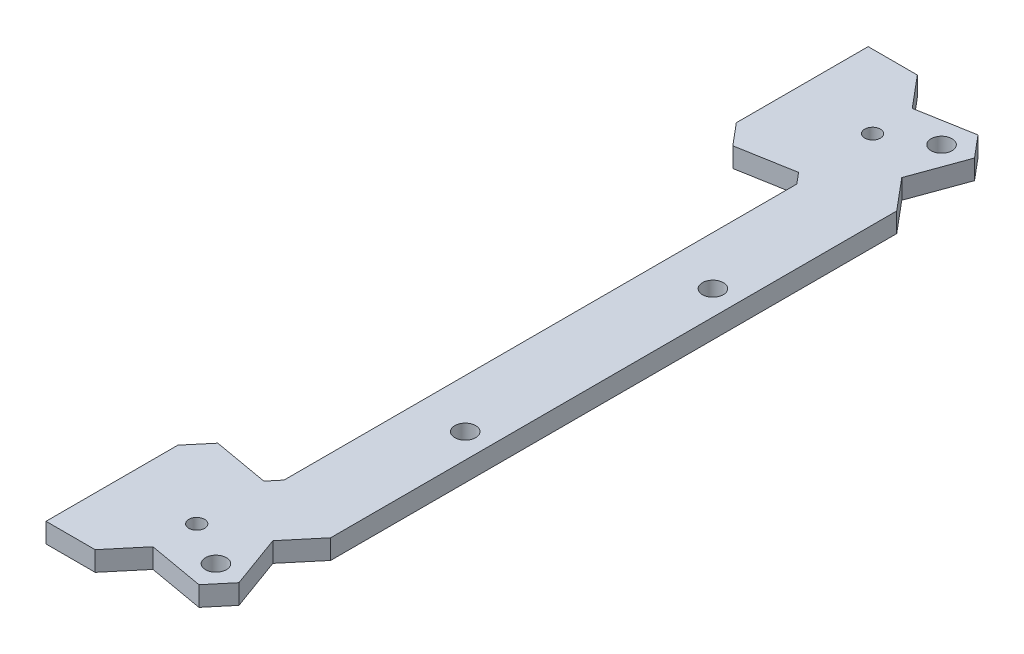
ISO-10303-21;
HEADER;
FILE_DESCRIPTION(('STEP AP214'),'2;1');
FILE_NAME('part.step','',(''),(''),'','','');
FILE_SCHEMA(('AUTOMOTIVE_DESIGN { 1 0 10303 214 1 1 1 1 }'));
ENDSEC;
DATA;
#1=APPLICATION_CONTEXT('core data for automotive mechanical design processes');
#2=APPLICATION_PROTOCOL_DEFINITION('international standard','automotive_design',2000,#1);
#3=PRODUCT_CONTEXT('',#1,'mechanical');
#4=PRODUCT('Part','Part','',(#3));
#5=PRODUCT_RELATED_PRODUCT_CATEGORY('part','',(#4));
#6=PRODUCT_DEFINITION_FORMATION('','',#4);
#7=PRODUCT_DEFINITION_CONTEXT('part definition',#1,'design');
#8=PRODUCT_DEFINITION('design','',#6,#7);
#9=PRODUCT_DEFINITION_SHAPE('','',#8);
#10=(LENGTH_UNIT() NAMED_UNIT(*) SI_UNIT(.MILLI.,.METRE.));
#11=(NAMED_UNIT(*) PLANE_ANGLE_UNIT() SI_UNIT($,.RADIAN.));
#12=(NAMED_UNIT(*) SI_UNIT($,.STERADIAN.) SOLID_ANGLE_UNIT());
#13=UNCERTAINTY_MEASURE_WITH_UNIT(LENGTH_MEASURE(1.E-05),#10,'distance_accuracy_value','');
#14=(GEOMETRIC_REPRESENTATION_CONTEXT(3) GLOBAL_UNCERTAINTY_ASSIGNED_CONTEXT((#13)) GLOBAL_UNIT_ASSIGNED_CONTEXT((#10,
#11,#12)) REPRESENTATION_CONTEXT('',''));
#15=CARTESIAN_POINT('',(0.,0.,0.));
#16=DIRECTION('',(0.,0.,1.));
#17=DIRECTION('',(1.,0.,0.));
#18=AXIS2_PLACEMENT_3D('',#15,#16,#17);
#19=CARTESIAN_POINT('',(2.76639358489003,-6.35,-15.6256596764258));
#20=DIRECTION('',(0.939692620785907,0.,-0.342020143325672));
#21=DIRECTION('',(-0.342020143325672,0.,-0.939692620785907));
#22=AXIS2_PLACEMENT_3D('',#19,#20,#21);
#23=PLANE('',#22);
#24=DIRECTION('',(-0.342020143325672,0.,-0.939692620785907));
#25=VECTOR('',#24,1.);
#26=CARTESIAN_POINT('',(2.76639358489003,0.,-15.6256596764258));
#27=LINE('',#26,#25);
#28=CARTESIAN_POINT('',(9.03592072759093,0.,1.59972457880263));
#29=VERTEX_POINT('',#28);
#30=CARTESIAN_POINT('',(2.76639358489003,0.,-15.6256596764258));
#31=VERTEX_POINT('',#30);
#32=EDGE_CURVE('E136',#29,#31,#27,.T.);
#33=ORIENTED_EDGE('',*,*,#32,.F.);
#34=DIRECTION('',(0.,1.,0.));
#35=VECTOR('',#34,1.);
#36=CARTESIAN_POINT('',(9.03592072759093,-6.35,1.59972457880263));
#37=LINE('',#36,#35);
#38=CARTESIAN_POINT('',(9.03592072759093,-6.35,1.59972457880263));
#39=VERTEX_POINT('',#38);
#40=EDGE_CURVE('E51',#39,#29,#37,.T.);
#41=ORIENTED_EDGE('',*,*,#40,.F.);
#42=DIRECTION('',(-0.342020143325672,0.,-0.939692620785907));
#43=VECTOR('',#42,1.);
#44=CARTESIAN_POINT('',(2.76639358489003,-6.35,-15.6256596764258));
#45=LINE('',#44,#43);
#46=CARTESIAN_POINT('',(2.76639358489003,-6.35,-15.6256596764258));
#47=VERTEX_POINT('',#46);
#48=EDGE_CURVE('E59',#39,#47,#45,.T.);
#49=ORIENTED_EDGE('',*,*,#48,.T.);
#50=DIRECTION('',(0.,1.,0.));
#51=VECTOR('',#50,1.);
#52=CARTESIAN_POINT('',(2.76639358489003,-6.35,-15.6256596764258));
#53=LINE('',#52,#51);
#54=EDGE_CURVE('E11',#47,#31,#53,.T.);
#55=ORIENTED_EDGE('',*,*,#54,.T.);
#56=EDGE_LOOP('',(#33,#41,#49,#55));
#57=FACE_BOUND('',#56,.T.);
#58=ADVANCED_FACE('F41',(#57),#23,.T.);
#59=CARTESIAN_POINT('',(9.03592072759093,-6.35,1.59972457880263));
#60=DIRECTION('',(0.766044443118982,0.,0.642787609686534));
#61=DIRECTION('',(0.642787609686534,0.,-0.766044443118983));
#62=AXIS2_PLACEMENT_3D('',#59,#60,#61);
#63=PLANE('',#62);
#64=DIRECTION('',(0.642787609686534,0.,-0.766044443118982));
#65=VECTOR('',#64,1.);
#66=CARTESIAN_POINT('',(9.03592072759093,0.,1.59972457880263));
#67=LINE('',#66,#65);
#68=CARTESIAN_POINT('',(3.14449233577813,0.,8.62085553025717));
#69=VERTEX_POINT('',#68);
#70=EDGE_CURVE('E101',#69,#29,#67,.T.);
#71=ORIENTED_EDGE('',*,*,#70,.F.);
#72=DIRECTION('',(0.,1.,0.));
#73=VECTOR('',#72,1.);
#74=CARTESIAN_POINT('',(3.14449233577813,-6.35,8.62085553025717));
#75=LINE('',#74,#73);
#76=CARTESIAN_POINT('',(3.14449233577813,-6.35,8.62085553025717));
#77=VERTEX_POINT('',#76);
#78=EDGE_CURVE('E97',#77,#69,#75,.T.);
#79=ORIENTED_EDGE('',*,*,#78,.F.);
#80=DIRECTION('',(0.642787609686534,0.,-0.766044443118982));
#81=VECTOR('',#80,1.);
#82=CARTESIAN_POINT('',(9.03592072759093,-6.35,1.59972457880263));
#83=LINE('',#82,#81);
#84=EDGE_CURVE('E100',#77,#39,#83,.T.);
#85=ORIENTED_EDGE('',*,*,#84,.T.);
#86=ORIENTED_EDGE('',*,*,#40,.T.);
#87=EDGE_LOOP('',(#71,#79,#85,#86));
#88=FACE_BOUND('',#87,.T.);
#89=ADVANCED_FACE('F99',(#88),#63,.T.);
#90=CARTESIAN_POINT('',(3.14449233577813,-6.35,8.62085553025717));
#91=DIRECTION('',(-0.173648177666922,0.,0.98480775301221));
#92=DIRECTION('',(0.98480775301221,0.,0.173648177666922));
#93=AXIS2_PLACEMENT_3D('',#90,#91,#92);
#94=PLANE('',#93);
#95=DIRECTION('',(0.98480775301221,0.,0.173648177666922));
#96=VECTOR('',#95,1.);
#97=CARTESIAN_POINT('',(3.14449233577813,0.,8.62085553025717));
#98=LINE('',#97,#96);
#99=CARTESIAN_POINT('',(-14.9078915905487,0.,5.4377331779381));
#100=VERTEX_POINT('',#99);
#101=EDGE_CURVE('E133',#100,#69,#98,.T.);
#102=ORIENTED_EDGE('',*,*,#101,.F.);
#103=DIRECTION('',(0.,1.,0.));
#104=VECTOR('',#103,1.);
#105=CARTESIAN_POINT('',(-14.9078915905487,-6.35,5.4377331779381));
#106=LINE('',#105,#104);
#107=CARTESIAN_POINT('',(-14.9078915905487,-6.35,5.4377331779381));
#108=VERTEX_POINT('',#107);
#109=EDGE_CURVE('E106',#108,#100,#106,.T.);
#110=ORIENTED_EDGE('',*,*,#109,.F.);
#111=DIRECTION('',(0.98480775301221,0.,0.173648177666922));
#112=VECTOR('',#111,1.);
#113=CARTESIAN_POINT('',(3.14449233577813,-6.35,8.62085553025717));
#114=LINE('',#113,#112);
#115=EDGE_CURVE('E113',#108,#77,#114,.T.);
#116=ORIENTED_EDGE('',*,*,#115,.T.);
#117=ORIENTED_EDGE('',*,*,#78,.T.);
#118=EDGE_LOOP('',(#102,#110,#116,#117));
#119=FACE_BOUND('',#118,.T.);
#120=ADVANCED_FACE('F117',(#119),#94,.T.);
#121=CARTESIAN_POINT('',(-33.4150335876715,-6.35,-34.0208555302572));
#122=DIRECTION('',(-0.766044443118983,0.,-0.642787609686534));
#123=DIRECTION('',(-0.642787609686534,0.,0.766044443118983));
#124=AXIS2_PLACEMENT_3D('',#121,#122,#123);
#125=PLANE('',#124);
#126=DIRECTION('',(-0.642787609686534,0.,0.766044443118983));
#127=VECTOR('',#126,1.);
#128=CARTESIAN_POINT('',(-33.4150335876715,0.,-34.0208555302572));
#129=LINE('',#128,#127);
#130=CARTESIAN_POINT('',(-33.4150335876715,0.,-34.0208555302572));
#131=VERTEX_POINT('',#130);
#132=CARTESIAN_POINT('',(-39.3064619794843,0.,-26.9997245788026));
#133=VERTEX_POINT('',#132);
#134=EDGE_CURVE('E129',#131,#133,#129,.T.);
#135=ORIENTED_EDGE('',*,*,#134,.F.);
#136=DIRECTION('',(0.,1.,0.));
#137=VECTOR('',#136,1.);
#138=CARTESIAN_POINT('',(-33.4150335876715,-6.35,-34.0208555302572));
#139=LINE('',#138,#137);
#140=CARTESIAN_POINT('',(-33.4150335876715,-6.35,-34.0208555302572));
#141=VERTEX_POINT('',#140);
#142=EDGE_CURVE('E142',#141,#131,#139,.T.);
#143=ORIENTED_EDGE('',*,*,#142,.F.);
#144=DIRECTION('',(-0.642787609686534,0.,0.766044443118983));
#145=VECTOR('',#144,1.);
#146=CARTESIAN_POINT('',(-33.4150335876715,-6.35,-34.0208555302572));
#147=LINE('',#146,#145);
#148=CARTESIAN_POINT('',(-39.3064619794843,-6.35,-26.9997245788026));
#149=VERTEX_POINT('',#148);
#150=EDGE_CURVE('E118',#141,#149,#147,.T.);
#151=ORIENTED_EDGE('',*,*,#150,.T.);
#152=DIRECTION('',(0.,1.,0.));
#153=VECTOR('',#152,1.);
#154=CARTESIAN_POINT('',(-39.3064619794843,-6.35,-26.9997245788026));
#155=LINE('',#154,#153);
#156=EDGE_CURVE('E140',#149,#133,#155,.T.);
#157=ORIENTED_EDGE('',*,*,#156,.T.);
#158=EDGE_LOOP('',(#135,#143,#151,#157));
#159=FACE_BOUND('',#158,.T.);
#160=ADVANCED_FACE('F280',(#159),#125,.T.);
#161=CARTESIAN_POINT('',(-15.3626496613448,-6.35,-30.8377331779381));
#162=DIRECTION('',(0.173648177666919,0.,-0.98480775301221));
#163=DIRECTION('',(-0.98480775301221,0.,-0.17364817766692));
#164=AXIS2_PLACEMENT_3D('',#161,#162,#163);
#165=PLANE('',#164);
#166=DIRECTION('',(-0.98480775301221,0.,-0.17364817766692));
#167=VECTOR('',#166,1.);
#168=CARTESIAN_POINT('',(-15.3626496613448,0.,-30.8377331779381));
#169=LINE('',#168,#167);
#170=CARTESIAN_POINT('',(-15.3626496613448,0.,-30.8377331779381));
#171=VERTEX_POINT('',#170);
#172=EDGE_CURVE('E126',#171,#131,#169,.T.);
#173=ORIENTED_EDGE('',*,*,#172,.F.);
#174=DIRECTION('',(0.,1.,0.));
#175=VECTOR('',#174,1.);
#176=CARTESIAN_POINT('',(-15.3626496613448,-6.35,-30.8377331779381));
#177=LINE('',#176,#175);
#178=CARTESIAN_POINT('',(-15.3626496613448,-6.35,-30.8377331779381));
#179=VERTEX_POINT('',#178);
#180=EDGE_CURVE('E45',#179,#171,#177,.T.);
#181=ORIENTED_EDGE('',*,*,#180,.F.);
#182=DIRECTION('',(-0.98480775301221,0.,-0.17364817766692));
#183=VECTOR('',#182,1.);
#184=CARTESIAN_POINT('',(-15.3626496613448,-6.35,-30.8377331779381));
#185=LINE('',#184,#183);
#186=EDGE_CURVE('E121',#179,#141,#185,.T.);
#187=ORIENTED_EDGE('',*,*,#186,.T.);
#188=ORIENTED_EDGE('',*,*,#142,.T.);
#189=EDGE_LOOP('',(#173,#181,#187,#188));
#190=FACE_BOUND('',#189,.T.);
#191=ADVANCED_FACE('F43',(#190),#165,.T.);
#192=CARTESIAN_POINT('',(0.,-6.35,0.));
#193=DIRECTION('',(0.,1.,0.));
#194=DIRECTION('',(0.,0.,1.));
#195=AXIS2_PLACEMENT_3D('',#192,#193,#194);
#196=PLANE('',#195);
#197=CARTESIAN_POINT('',(-14.2479133606641,-6.35,-226.379452417458));
#198=DIRECTION('',(0.,1.,0.));
#199=DIRECTION('',(0.,0.,1.));
#200=AXIS2_PLACEMENT_3D('',#197,#198,#199);
#201=CIRCLE('',#200,2.54);
#202=CARTESIAN_POINT('',(-14.2479133606641,-6.35,-223.839452417458));
#203=VERTEX_POINT('',#202);
#204=EDGE_CURVE('E343',#203,#203,#201,.T.);
#205=ORIENTED_EDGE('',*,*,#204,.T.);
#206=EDGE_LOOP('',(#205));
#207=FACE_BOUND('',#206,.T.);
#208=CARTESIAN_POINT('',(-14.2479133606641,-6.35,-8.04329100000001));
#209=DIRECTION('',(0.,1.,0.));
#210=DIRECTION('',(0.,0.,1.));
#211=AXIS2_PLACEMENT_3D('',#208,#209,#210);
#212=CIRCLE('',#211,2.54);
#213=CARTESIAN_POINT('',(-14.2479133606641,-6.35,-5.50329100000001));
#214=VERTEX_POINT('',#213);
#215=EDGE_CURVE('E349',#214,#214,#212,.T.);
#216=ORIENTED_EDGE('',*,*,#215,.T.);
#217=EDGE_LOOP('',(#216));
#218=FACE_BOUND('',#217,.T.);
#219=CARTESIAN_POINT('',(0.,-6.35,0.));
#220=DIRECTION('',(0.,1.,0.));
#221=DIRECTION('',(0.,0.,1.));
#222=AXIS2_PLACEMENT_3D('',#219,#220,#221);
#223=CIRCLE('',#222,3.3782);
#224=CARTESIAN_POINT('',(0.,-6.35,3.3782));
#225=VERTEX_POINT('',#224);
#226=EDGE_CURVE('E355',#225,#225,#223,.T.);
#227=ORIENTED_EDGE('',*,*,#226,.T.);
#228=EDGE_LOOP('',(#227));
#229=FACE_BOUND('',#228,.T.);
#230=CARTESIAN_POINT('',(3.33380593060688,-6.35,-77.2113717087289));
#231=DIRECTION('',(0.,1.,0.));
#232=DIRECTION('',(0.,0.,1.));
#233=AXIS2_PLACEMENT_3D('',#230,#231,#232);
#234=CIRCLE('',#233,3.3782);
#235=CARTESIAN_POINT('',(3.33380593060688,-6.35,-73.8331717087289));
#236=VERTEX_POINT('',#235);
#237=EDGE_CURVE('E361',#236,#236,#234,.T.);
#238=ORIENTED_EDGE('',*,*,#237,.T.);
#239=EDGE_LOOP('',(#238));
#240=FACE_BOUND('',#239,.T.);
#241=CARTESIAN_POINT('',(3.33380593060688,-6.35,-157.211371708729));
#242=DIRECTION('',(0.,1.,0.));
#243=DIRECTION('',(0.,0.,1.));
#244=AXIS2_PLACEMENT_3D('',#241,#242,#243);
#245=CIRCLE('',#244,3.3782);
#246=CARTESIAN_POINT('',(3.33380593060688,-6.35,-153.833171708729));
#247=VERTEX_POINT('',#246);
#248=EDGE_CURVE('E367',#247,#247,#245,.T.);
#249=ORIENTED_EDGE('',*,*,#248,.T.);
#250=EDGE_LOOP('',(#249));
#251=FACE_BOUND('',#250,.T.);
#252=CARTESIAN_POINT('',(0.,-6.35,-234.422743417458));
#253=DIRECTION('',(0.,1.,0.));
#254=DIRECTION('',(0.,0.,1.));
#255=AXIS2_PLACEMENT_3D('',#252,#253,#254);
#256=CIRCLE('',#255,3.3782);
#257=CARTESIAN_POINT('',(0.,-6.35,-231.044543417458));
#258=VERTEX_POINT('',#257);
#259=EDGE_CURVE('E373',#258,#258,#256,.T.);
#260=ORIENTED_EDGE('',*,*,#259,.T.);
#261=EDGE_LOOP('',(#260));
#262=FACE_BOUND('',#261,.T.);
#263=ORIENTED_EDGE('',*,*,#186,.F.);
#264=DIRECTION('',(0.642787609686532,0.,-0.766044443118984));
#265=VECTOR('',#264,1.);
#266=CARTESIAN_POINT('',(-12.381779271648,-6.35,-34.3901961739171));
#267=LINE('',#266,#265);
#268=CARTESIAN_POINT('',(-12.381779271648,-6.35,-34.3901961739171));
#269=VERTEX_POINT('',#268);
#270=EDGE_CURVE('E153',#179,#269,#267,.T.);
#271=ORIENTED_EDGE('',*,*,#270,.T.);
#272=DIRECTION('',(0.,0.,-1.));
#273=VECTOR('',#272,1.);
#274=CARTESIAN_POINT('',(-12.381779271648,-6.35,-200.032547243541));
#275=LINE('',#274,#273);
#276=CARTESIAN_POINT('',(-12.381779271648,-6.35,-200.032547243541));
#277=VERTEX_POINT('',#276);
#278=EDGE_CURVE('E399',#269,#277,#275,.T.);
#279=ORIENTED_EDGE('',*,*,#278,.T.);
#280=DIRECTION('',(-0.642787609686528,0.,-0.766044443118987));
#281=VECTOR('',#280,1.);
#282=CARTESIAN_POINT('',(-15.3626496613448,-6.35,-203.58501023952));
#283=LINE('',#282,#281);
#284=CARTESIAN_POINT('',(-15.3626496613448,-6.35,-203.58501023952));
#285=VERTEX_POINT('',#284);
#286=EDGE_CURVE('E397',#277,#285,#283,.T.);
#287=ORIENTED_EDGE('',*,*,#286,.T.);
#288=DIRECTION('',(-0.98480775301221,0.,0.173648177666919));
#289=VECTOR('',#288,1.);
#290=CARTESIAN_POINT('',(-33.4150335876716,-6.35,-200.401887887201));
#291=LINE('',#290,#289);
#292=CARTESIAN_POINT('',(-33.4150335876716,-6.35,-200.401887887201));
#293=VERTEX_POINT('',#292);
#294=EDGE_CURVE('E238',#285,#293,#291,.T.);
#295=ORIENTED_EDGE('',*,*,#294,.T.);
#296=DIRECTION('',(-0.642787609686534,0.,-0.766044443118982));
#297=VECTOR('',#296,1.);
#298=CARTESIAN_POINT('',(-39.3064619794844,-6.35,-207.423018838655));
#299=LINE('',#298,#297);
#300=CARTESIAN_POINT('',(-39.3064619794844,-6.35,-207.423018838655));
#301=VERTEX_POINT('',#300);
#302=EDGE_CURVE('E393',#293,#301,#299,.T.);
#303=ORIENTED_EDGE('',*,*,#302,.T.);
#304=DIRECTION('',(0.,0.,-1.));
#305=VECTOR('',#304,1.);
#306=CARTESIAN_POINT('',(-39.3064619794844,-6.35,-250.011371708729));
#307=LINE('',#306,#305);
#308=CARTESIAN_POINT('',(-39.3064619794844,-6.35,-250.011371708729));
#309=VERTEX_POINT('',#308);
#310=EDGE_CURVE('E651',#301,#309,#307,.T.);
#311=ORIENTED_EDGE('',*,*,#310,.T.);
#312=DIRECTION('',(1.,0.,0.));
#313=VECTOR('',#312,1.);
#314=CARTESIAN_POINT('',(-23.4255039362655,-6.35,-250.011371708729));
#315=LINE('',#314,#313);
#316=CARTESIAN_POINT('',(-23.4255039362655,-6.35,-250.011371708729));
#317=VERTEX_POINT('',#316);
#318=EDGE_CURVE('E327',#309,#317,#315,.T.);
#319=ORIENTED_EDGE('',*,*,#318,.T.);
#320=DIRECTION('',(0.642787609686534,0.,0.766044443118983));
#321=VECTOR('',#320,1.);
#322=CARTESIAN_POINT('',(-14.9078915905487,-6.35,-239.860476595396));
#323=LINE('',#322,#321);
#324=CARTESIAN_POINT('',(-14.9078915905487,-6.35,-239.860476595396));
#325=VERTEX_POINT('',#324);
#326=EDGE_CURVE('E333',#317,#325,#323,.T.);
#327=ORIENTED_EDGE('',*,*,#326,.T.);
#328=DIRECTION('',(0.98480775301221,0.,-0.173648177666921));
#329=VECTOR('',#328,1.);
#330=CARTESIAN_POINT('',(3.14449233577808,-6.35,-243.043598947715));
#331=LINE('',#330,#329);
#332=CARTESIAN_POINT('',(3.14449233577808,-6.35,-243.043598947715));
#333=VERTEX_POINT('',#332);
#334=EDGE_CURVE('E390',#325,#333,#331,.T.);
#335=ORIENTED_EDGE('',*,*,#334,.T.);
#336=DIRECTION('',(0.642787609686535,0.,0.766044443118982));
#337=VECTOR('',#336,1.);
#338=CARTESIAN_POINT('',(9.03592072759098,-6.35,-236.02246799626));
#339=LINE('',#338,#337);
#340=CARTESIAN_POINT('',(9.03592072759098,-6.35,-236.02246799626));
#341=VERTEX_POINT('',#340);
#342=EDGE_CURVE('E387',#333,#341,#339,.T.);
#343=ORIENTED_EDGE('',*,*,#342,.T.);
#344=DIRECTION('',(-0.342020143325672,0.,0.939692620785907));
#345=VECTOR('',#344,1.);
#346=CARTESIAN_POINT('',(2.76639358489007,-6.35,-218.797083741032));
#347=LINE('',#346,#345);
#348=CARTESIAN_POINT('',(2.76639358489007,-6.35,-218.797083741032));
#349=VERTEX_POINT('',#348);
#350=EDGE_CURVE('E384',#341,#349,#347,.T.);
#351=ORIENTED_EDGE('',*,*,#350,.T.);
#352=DIRECTION('',(0.642787609686531,0.,0.766044443118985));
#353=VECTOR('',#352,1.);
#354=CARTESIAN_POINT('',(11.2840059306069,-6.35,-208.646188627699));
#355=LINE('',#354,#353);
#356=CARTESIAN_POINT('',(11.2840059306069,-6.35,-208.646188627699));
#357=VERTEX_POINT('',#356);
#358=EDGE_CURVE('E381',#349,#357,#355,.T.);
#359=ORIENTED_EDGE('',*,*,#358,.T.);
#360=DIRECTION('',(0.,0.,1.));
#361=VECTOR('',#360,1.);
#362=CARTESIAN_POINT('',(11.2840059306069,-6.35,-25.7765547897589));
#363=LINE('',#362,#361);
#364=CARTESIAN_POINT('',(11.2840059306069,-6.35,-25.7765547897589));
#365=VERTEX_POINT('',#364);
#366=EDGE_CURVE('E378',#357,#365,#363,.T.);
#367=ORIENTED_EDGE('',*,*,#366,.T.);
#368=DIRECTION('',(-0.642787609686532,0.,0.766044443118984));
#369=VECTOR('',#368,1.);
#370=CARTESIAN_POINT('',(2.76639358489003,-6.35,-15.6256596764258));
#371=LINE('',#370,#369);
#372=EDGE_CURVE('E376',#365,#47,#371,.T.);
#373=ORIENTED_EDGE('',*,*,#372,.T.);
#374=ORIENTED_EDGE('',*,*,#48,.F.);
#375=ORIENTED_EDGE('',*,*,#84,.F.);
#376=ORIENTED_EDGE('',*,*,#115,.F.);
#377=DIRECTION('',(-0.642787609686535,0.,0.766044443118982));
#378=VECTOR('',#377,1.);
#379=CARTESIAN_POINT('',(-14.9078915905487,-6.35,5.4377331779381));
#380=LINE('',#379,#378);
#381=CARTESIAN_POINT('',(-23.4255039362656,-6.35,15.5886282912711));
#382=VERTEX_POINT('',#381);
#383=EDGE_CURVE('E667',#108,#382,#380,.T.);
#384=ORIENTED_EDGE('',*,*,#383,.T.);
#385=DIRECTION('',(-1.,0.,0.));
#386=VECTOR('',#385,1.);
#387=CARTESIAN_POINT('',(-23.4255039362656,-6.35,15.5886282912711));
#388=LINE('',#387,#386);
#389=CARTESIAN_POINT('',(-39.3064619794843,-6.35,15.5886282912711));
#390=VERTEX_POINT('',#389);
#391=EDGE_CURVE('E664',#382,#390,#388,.T.);
#392=ORIENTED_EDGE('',*,*,#391,.T.);
#393=DIRECTION('',(0.,0.,-1.));
#394=VECTOR('',#393,1.);
#395=CARTESIAN_POINT('',(-39.3064619794843,-6.35,15.5886282912711));
#396=LINE('',#395,#394);
#397=EDGE_CURVE('E278',#390,#149,#396,.T.);
#398=ORIENTED_EDGE('',*,*,#397,.T.);
#399=ORIENTED_EDGE('',*,*,#150,.F.);
#400=EDGE_LOOP('',(#263,#271,#279,#287,#295,#303,#311,#319,#327,#335,#343,#351,#359,#367,#373,
#374,#375,#376,#384,#392,#398,#399));
#401=FACE_BOUND('',#400,.T.);
#402=ADVANCED_FACE('F110',(#207,#218,#229,#240,#251,#262,#401),#196,.F.);
#403=CARTESIAN_POINT('',(0.,0.,0.));
#404=DIRECTION('',(0.,1.,0.));
#405=DIRECTION('',(0.,0.,1.));
#406=AXIS2_PLACEMENT_3D('',#403,#404,#405);
#407=PLANE('',#406);
#408=CARTESIAN_POINT('',(-14.2479133606641,0.,-226.379452417458));
#409=DIRECTION('',(0.,1.,0.));
#410=DIRECTION('',(0.,0.,1.));
#411=AXIS2_PLACEMENT_3D('',#408,#409,#410);
#412=CIRCLE('',#411,2.54);
#413=CARTESIAN_POINT('',(-14.2479133606641,0.,-223.839452417458));
#414=VERTEX_POINT('',#413);
#415=EDGE_CURVE('E340',#414,#414,#412,.T.);
#416=ORIENTED_EDGE('',*,*,#415,.F.);
#417=EDGE_LOOP('',(#416));
#418=FACE_BOUND('',#417,.T.);
#419=CARTESIAN_POINT('',(-14.2479133606641,0.,-8.04329100000001));
#420=DIRECTION('',(0.,1.,0.));
#421=DIRECTION('',(0.,0.,1.));
#422=AXIS2_PLACEMENT_3D('',#419,#420,#421);
#423=CIRCLE('',#422,2.54);
#424=CARTESIAN_POINT('',(-14.2479133606641,0.,-5.50329100000001));
#425=VERTEX_POINT('',#424);
#426=EDGE_CURVE('E346',#425,#425,#423,.T.);
#427=ORIENTED_EDGE('',*,*,#426,.F.);
#428=EDGE_LOOP('',(#427));
#429=FACE_BOUND('',#428,.T.);
#430=CARTESIAN_POINT('',(0.,0.,0.));
#431=DIRECTION('',(0.,1.,0.));
#432=DIRECTION('',(0.,0.,1.));
#433=AXIS2_PLACEMENT_3D('',#430,#431,#432);
#434=CIRCLE('',#433,3.3782);
#435=CARTESIAN_POINT('',(0.,0.,3.3782));
#436=VERTEX_POINT('',#435);
#437=EDGE_CURVE('E352',#436,#436,#434,.T.);
#438=ORIENTED_EDGE('',*,*,#437,.F.);
#439=EDGE_LOOP('',(#438));
#440=FACE_BOUND('',#439,.T.);
#441=CARTESIAN_POINT('',(3.33380593060688,0.,-77.2113717087289));
#442=DIRECTION('',(0.,1.,0.));
#443=DIRECTION('',(0.,0.,1.));
#444=AXIS2_PLACEMENT_3D('',#441,#442,#443);
#445=CIRCLE('',#444,3.3782);
#446=CARTESIAN_POINT('',(3.33380593060688,0.,-73.8331717087289));
#447=VERTEX_POINT('',#446);
#448=EDGE_CURVE('E358',#447,#447,#445,.T.);
#449=ORIENTED_EDGE('',*,*,#448,.F.);
#450=EDGE_LOOP('',(#449));
#451=FACE_BOUND('',#450,.T.);
#452=CARTESIAN_POINT('',(3.33380593060688,0.,-157.211371708729));
#453=DIRECTION('',(0.,1.,0.));
#454=DIRECTION('',(0.,0.,1.));
#455=AXIS2_PLACEMENT_3D('',#452,#453,#454);
#456=CIRCLE('',#455,3.3782);
#457=CARTESIAN_POINT('',(3.33380593060688,0.,-153.833171708729));
#458=VERTEX_POINT('',#457);
#459=EDGE_CURVE('E364',#458,#458,#456,.T.);
#460=ORIENTED_EDGE('',*,*,#459,.F.);
#461=EDGE_LOOP('',(#460));
#462=FACE_BOUND('',#461,.T.);
#463=CARTESIAN_POINT('',(0.,0.,-234.422743417458));
#464=DIRECTION('',(0.,1.,0.));
#465=DIRECTION('',(0.,0.,1.));
#466=AXIS2_PLACEMENT_3D('',#463,#464,#465);
#467=CIRCLE('',#466,3.3782);
#468=CARTESIAN_POINT('',(0.,0.,-231.044543417458));
#469=VERTEX_POINT('',#468);
#470=EDGE_CURVE('E370',#469,#469,#467,.T.);
#471=ORIENTED_EDGE('',*,*,#470,.F.);
#472=EDGE_LOOP('',(#471));
#473=FACE_BOUND('',#472,.T.);
#474=ORIENTED_EDGE('',*,*,#32,.T.);
#475=DIRECTION('',(-0.642787609686532,0.,0.766044443118985));
#476=VECTOR('',#475,1.);
#477=CARTESIAN_POINT('',(2.76639358489003,0.,-15.6256596764258));
#478=LINE('',#477,#476);
#479=CARTESIAN_POINT('',(11.2840059306069,0.,-25.7765547897589));
#480=VERTEX_POINT('',#479);
#481=EDGE_CURVE('E130',#480,#31,#478,.T.);
#482=ORIENTED_EDGE('',*,*,#481,.F.);
#483=DIRECTION('',(0.,0.,1.));
#484=VECTOR('',#483,1.);
#485=CARTESIAN_POINT('',(11.2840059306069,0.,-25.7765547897589));
#486=LINE('',#485,#484);
#487=CARTESIAN_POINT('',(11.2840059306069,0.,-208.646188627699));
#488=VERTEX_POINT('',#487);
#489=EDGE_CURVE('E253',#488,#480,#486,.T.);
#490=ORIENTED_EDGE('',*,*,#489,.F.);
#491=DIRECTION('',(0.642787609686531,0.,0.766044443118985));
#492=VECTOR('',#491,1.);
#493=CARTESIAN_POINT('',(11.2840059306069,0.,-208.646188627699));
#494=LINE('',#493,#492);
#495=CARTESIAN_POINT('',(2.76639358489007,0.,-218.797083741032));
#496=VERTEX_POINT('',#495);
#497=EDGE_CURVE('E256',#496,#488,#494,.T.);
#498=ORIENTED_EDGE('',*,*,#497,.F.);
#499=DIRECTION('',(-0.342020143325672,0.,0.939692620785907));
#500=VECTOR('',#499,1.);
#501=CARTESIAN_POINT('',(2.76639358489007,0.,-218.797083741032));
#502=LINE('',#501,#500);
#503=CARTESIAN_POINT('',(9.03592072759098,0.,-236.02246799626));
#504=VERTEX_POINT('',#503);
#505=EDGE_CURVE('E259',#504,#496,#502,.T.);
#506=ORIENTED_EDGE('',*,*,#505,.F.);
#507=DIRECTION('',(0.642787609686535,0.,0.766044443118982));
#508=VECTOR('',#507,1.);
#509=CARTESIAN_POINT('',(9.03592072759098,0.,-236.02246799626));
#510=LINE('',#509,#508);
#511=CARTESIAN_POINT('',(3.14449233577808,0.,-243.043598947715));
#512=VERTEX_POINT('',#511);
#513=EDGE_CURVE('E262',#512,#504,#510,.T.);
#514=ORIENTED_EDGE('',*,*,#513,.F.);
#515=DIRECTION('',(0.98480775301221,0.,-0.173648177666921));
#516=VECTOR('',#515,1.);
#517=CARTESIAN_POINT('',(3.14449233577808,0.,-243.043598947715));
#518=LINE('',#517,#516);
#519=CARTESIAN_POINT('',(-14.9078915905487,0.,-239.860476595396));
#520=VERTEX_POINT('',#519);
#521=EDGE_CURVE('E265',#520,#512,#518,.T.);
#522=ORIENTED_EDGE('',*,*,#521,.F.);
#523=DIRECTION('',(0.642787609686534,0.,0.766044443118983));
#524=VECTOR('',#523,1.);
#525=CARTESIAN_POINT('',(-14.9078915905487,0.,-239.860476595396));
#526=LINE('',#525,#524);
#527=CARTESIAN_POINT('',(-23.4255039362655,0.,-250.011371708729));
#528=VERTEX_POINT('',#527);
#529=EDGE_CURVE('E312',#528,#520,#526,.T.);
#530=ORIENTED_EDGE('',*,*,#529,.F.);
#531=DIRECTION('',(1.,0.,0.));
#532=VECTOR('',#531,1.);
#533=CARTESIAN_POINT('',(-23.4255039362655,0.,-250.011371708729));
#534=LINE('',#533,#532);
#535=CARTESIAN_POINT('',(-39.3064619794844,0.,-250.011371708729));
#536=VERTEX_POINT('',#535);
#537=EDGE_CURVE('E315',#536,#528,#534,.T.);
#538=ORIENTED_EDGE('',*,*,#537,.F.);
#539=DIRECTION('',(0.,0.,-1.));
#540=VECTOR('',#539,1.);
#541=CARTESIAN_POINT('',(-39.3064619794844,0.,-250.011371708729));
#542=LINE('',#541,#540);
#543=CARTESIAN_POINT('',(-39.3064619794844,0.,-207.423018838655));
#544=VERTEX_POINT('',#543);
#545=EDGE_CURVE('E318',#544,#536,#542,.T.);
#546=ORIENTED_EDGE('',*,*,#545,.F.);
#547=DIRECTION('',(-0.642787609686534,0.,-0.766044443118982));
#548=VECTOR('',#547,1.);
#549=CARTESIAN_POINT('',(-39.3064619794844,0.,-207.423018838655));
#550=LINE('',#549,#548);
#551=CARTESIAN_POINT('',(-33.4150335876716,0.,-200.401887887201));
#552=VERTEX_POINT('',#551);
#553=EDGE_CURVE('E229',#552,#544,#550,.T.);
#554=ORIENTED_EDGE('',*,*,#553,.F.);
#555=DIRECTION('',(-0.98480775301221,0.,0.173648177666919));
#556=VECTOR('',#555,1.);
#557=CARTESIAN_POINT('',(-33.4150335876716,0.,-200.401887887201));
#558=LINE('',#557,#556);
#559=CARTESIAN_POINT('',(-15.3626496613448,0.,-203.58501023952));
#560=VERTEX_POINT('',#559);
#561=EDGE_CURVE('E222',#560,#552,#558,.T.);
#562=ORIENTED_EDGE('',*,*,#561,.F.);
#563=DIRECTION('',(-0.642787609686528,0.,-0.766044443118987));
#564=VECTOR('',#563,1.);
#565=CARTESIAN_POINT('',(-15.3626496613448,0.,-203.58501023952));
#566=LINE('',#565,#564);
#567=CARTESIAN_POINT('',(-12.381779271648,0.,-200.032547243541));
#568=VERTEX_POINT('',#567);
#569=EDGE_CURVE('E226',#568,#560,#566,.T.);
#570=ORIENTED_EDGE('',*,*,#569,.F.);
#571=DIRECTION('',(0.,0.,-1.));
#572=VECTOR('',#571,1.);
#573=CARTESIAN_POINT('',(-12.381779271648,0.,-200.032547243541));
#574=LINE('',#573,#572);
#575=CARTESIAN_POINT('',(-12.381779271648,0.,-34.3901961739171));
#576=VERTEX_POINT('',#575);
#577=EDGE_CURVE('E163',#576,#568,#574,.T.);
#578=ORIENTED_EDGE('',*,*,#577,.F.);
#579=DIRECTION('',(0.642787609686532,0.,-0.766044443118984));
#580=VECTOR('',#579,1.);
#581=CARTESIAN_POINT('',(-12.381779271648,0.,-34.3901961739171));
#582=LINE('',#581,#580);
#583=EDGE_CURVE('E151',#171,#576,#582,.T.);
#584=ORIENTED_EDGE('',*,*,#583,.F.);
#585=ORIENTED_EDGE('',*,*,#172,.T.);
#586=ORIENTED_EDGE('',*,*,#134,.T.);
#587=DIRECTION('',(0.,0.,-1.));
#588=VECTOR('',#587,1.);
#589=CARTESIAN_POINT('',(-39.3064619794843,0.,15.5886282912711));
#590=LINE('',#589,#588);
#591=CARTESIAN_POINT('',(-39.3064619794843,0.,15.5886282912711));
#592=VERTEX_POINT('',#591);
#593=EDGE_CURVE('E635',#592,#133,#590,.T.);
#594=ORIENTED_EDGE('',*,*,#593,.F.);
#595=DIRECTION('',(-1.,0.,0.));
#596=VECTOR('',#595,1.);
#597=CARTESIAN_POINT('',(-23.4255039362656,0.,15.5886282912711));
#598=LINE('',#597,#596);
#599=CARTESIAN_POINT('',(-23.4255039362656,0.,15.5886282912711));
#600=VERTEX_POINT('',#599);
#601=EDGE_CURVE('E637',#600,#592,#598,.T.);
#602=ORIENTED_EDGE('',*,*,#601,.F.);
#603=DIRECTION('',(-0.642787609686535,0.,0.766044443118982));
#604=VECTOR('',#603,1.);
#605=CARTESIAN_POINT('',(-14.9078915905487,0.,5.4377331779381));
#606=LINE('',#605,#604);
#607=EDGE_CURVE('E645',#100,#600,#606,.T.);
#608=ORIENTED_EDGE('',*,*,#607,.F.);
#609=ORIENTED_EDGE('',*,*,#101,.T.);
#610=ORIENTED_EDGE('',*,*,#70,.T.);
#611=EDGE_LOOP('',(#474,#482,#490,#498,#506,#514,#522,#530,#538,#546,#554,#562,#570,#578,#584,
#585,#586,#594,#602,#608,#609,#610));
#612=FACE_BOUND('',#611,.T.);
#613=ADVANCED_FACE('F224',(#418,#429,#440,#451,#462,#473,#612),#407,.T.);
#614=CARTESIAN_POINT('',(-12.381779271648,232.97706871227,-34.3901961739171));
#615=DIRECTION('',(-0.766044443118984,0.,-0.642787609686532));
#616=DIRECTION('',(-0.642787609686532,0.,0.766044443118984));
#617=AXIS2_PLACEMENT_3D('',#614,#615,#616);
#618=PLANE('',#617);
#619=ORIENTED_EDGE('',*,*,#180,.T.);
#620=ORIENTED_EDGE('',*,*,#583,.T.);
#621=DIRECTION('',(0.,-1.,0.));
#622=VECTOR('',#621,1.);
#623=CARTESIAN_POINT('',(-12.381779271648,232.97706871227,-34.3901961739171));
#624=LINE('',#623,#622);
#625=EDGE_CURVE('E250',#576,#269,#624,.T.);
#626=ORIENTED_EDGE('',*,*,#625,.T.);
#627=ORIENTED_EDGE('',*,*,#270,.F.);
#628=EDGE_LOOP('',(#619,#620,#626,#627));
#629=FACE_BOUND('',#628,.T.);
#630=ADVANCED_FACE('F147',(#629),#618,.T.);
#631=CARTESIAN_POINT('',(-12.381779271648,232.97706871227,-200.032547243541));
#632=DIRECTION('',(-1.,0.,0.));
#633=DIRECTION('',(0.,0.,1.));
#634=AXIS2_PLACEMENT_3D('',#631,#632,#633);
#635=PLANE('',#634);
#636=ORIENTED_EDGE('',*,*,#625,.F.);
#637=ORIENTED_EDGE('',*,*,#577,.T.);
#638=DIRECTION('',(0.,-1.,0.));
#639=VECTOR('',#638,1.);
#640=CARTESIAN_POINT('',(-12.381779271648,232.97706871227,-200.032547243541));
#641=LINE('',#640,#639);
#642=EDGE_CURVE('E244',#568,#277,#641,.T.);
#643=ORIENTED_EDGE('',*,*,#642,.T.);
#644=ORIENTED_EDGE('',*,*,#278,.F.);
#645=EDGE_LOOP('',(#636,#637,#643,#644));
#646=FACE_BOUND('',#645,.T.);
#647=ADVANCED_FACE('F419',(#646),#635,.T.);
#648=CARTESIAN_POINT('',(-15.3626496613448,232.97706871227,-203.58501023952));
#649=DIRECTION('',(-0.766044443118987,0.,0.642787609686528));
#650=DIRECTION('',(0.642787609686528,0.,0.766044443118987));
#651=AXIS2_PLACEMENT_3D('',#648,#649,#650);
#652=PLANE('',#651);
#653=ORIENTED_EDGE('',*,*,#642,.F.);
#654=ORIENTED_EDGE('',*,*,#569,.T.);
#655=DIRECTION('',(0.,-1.,0.));
#656=VECTOR('',#655,1.);
#657=CARTESIAN_POINT('',(-15.3626496613448,232.97706871227,-203.58501023952));
#658=LINE('',#657,#656);
#659=EDGE_CURVE('E233',#560,#285,#658,.T.);
#660=ORIENTED_EDGE('',*,*,#659,.T.);
#661=ORIENTED_EDGE('',*,*,#286,.F.);
#662=EDGE_LOOP('',(#653,#654,#660,#661));
#663=FACE_BOUND('',#662,.T.);
#664=ADVANCED_FACE('F243',(#663),#652,.T.);
#665=CARTESIAN_POINT('',(-33.4150335876716,232.97706871227,-200.401887887201));
#666=DIRECTION('',(0.173648177666919,0.,0.98480775301221));
#667=DIRECTION('',(0.98480775301221,0.,-0.173648177666919));
#668=AXIS2_PLACEMENT_3D('',#665,#666,#667);
#669=PLANE('',#668);
#670=ORIENTED_EDGE('',*,*,#659,.F.);
#671=ORIENTED_EDGE('',*,*,#561,.T.);
#672=DIRECTION('',(0.,-1.,0.));
#673=VECTOR('',#672,1.);
#674=CARTESIAN_POINT('',(-33.4150335876716,232.97706871227,-200.401887887201));
#675=LINE('',#674,#673);
#676=EDGE_CURVE('E232',#552,#293,#675,.T.);
#677=ORIENTED_EDGE('',*,*,#676,.T.);
#678=ORIENTED_EDGE('',*,*,#294,.F.);
#679=EDGE_LOOP('',(#670,#671,#677,#678));
#680=FACE_BOUND('',#679,.T.);
#681=ADVANCED_FACE('F236',(#680),#669,.T.);
#682=CARTESIAN_POINT('',(-39.3064619794844,232.97706871227,-207.423018838655));
#683=DIRECTION('',(-0.766044443118982,0.,0.642787609686534));
#684=DIRECTION('',(0.642787609686534,0.,0.766044443118982));
#685=AXIS2_PLACEMENT_3D('',#682,#683,#684);
#686=PLANE('',#685);
#687=ORIENTED_EDGE('',*,*,#676,.F.);
#688=ORIENTED_EDGE('',*,*,#553,.T.);
#689=DIRECTION('',(0.,-1.,0.));
#690=VECTOR('',#689,1.);
#691=CARTESIAN_POINT('',(-39.3064619794844,232.97706871227,-207.423018838655));
#692=LINE('',#691,#690);
#693=EDGE_CURVE('E269',#544,#301,#692,.T.);
#694=ORIENTED_EDGE('',*,*,#693,.T.);
#695=ORIENTED_EDGE('',*,*,#302,.F.);
#696=EDGE_LOOP('',(#687,#688,#694,#695));
#697=FACE_BOUND('',#696,.T.);
#698=ADVANCED_FACE('F415',(#697),#686,.T.);
#699=CARTESIAN_POINT('',(3.14449233577808,232.97706871227,-243.043598947715));
#700=DIRECTION('',(-0.173648177666921,0.,-0.98480775301221));
#701=DIRECTION('',(-0.98480775301221,0.,0.173648177666921));
#702=AXIS2_PLACEMENT_3D('',#699,#700,#701);
#703=PLANE('',#702);
#704=DIRECTION('',(0.,-1.,0.));
#705=VECTOR('',#704,1.);
#706=CARTESIAN_POINT('',(-14.9078915905487,232.97706871227,-239.860476595396));
#707=LINE('',#706,#705);
#708=EDGE_CURVE('E266',#520,#325,#707,.T.);
#709=ORIENTED_EDGE('',*,*,#708,.F.);
#710=ORIENTED_EDGE('',*,*,#521,.T.);
#711=DIRECTION('',(0.,-1.,0.));
#712=VECTOR('',#711,1.);
#713=CARTESIAN_POINT('',(3.14449233577808,232.97706871227,-243.043598947715));
#714=LINE('',#713,#712);
#715=EDGE_CURVE('E263',#512,#333,#714,.T.);
#716=ORIENTED_EDGE('',*,*,#715,.T.);
#717=ORIENTED_EDGE('',*,*,#334,.F.);
#718=EDGE_LOOP('',(#709,#710,#716,#717));
#719=FACE_BOUND('',#718,.T.);
#720=ADVANCED_FACE('F496',(#719),#703,.T.);
#721=CARTESIAN_POINT('',(9.03592072759098,232.97706871227,-236.02246799626));
#722=DIRECTION('',(0.766044443118982,0.,-0.642787609686535));
#723=DIRECTION('',(-0.642787609686535,0.,-0.766044443118982));
#724=AXIS2_PLACEMENT_3D('',#721,#722,#723);
#725=PLANE('',#724);
#726=ORIENTED_EDGE('',*,*,#715,.F.);
#727=ORIENTED_EDGE('',*,*,#513,.T.);
#728=DIRECTION('',(0.,-1.,0.));
#729=VECTOR('',#728,1.);
#730=CARTESIAN_POINT('',(9.03592072759098,232.97706871227,-236.02246799626));
#731=LINE('',#730,#729);
#732=EDGE_CURVE('E260',#504,#341,#731,.T.);
#733=ORIENTED_EDGE('',*,*,#732,.T.);
#734=ORIENTED_EDGE('',*,*,#342,.F.);
#735=EDGE_LOOP('',(#726,#727,#733,#734));
#736=FACE_BOUND('',#735,.T.);
#737=ADVANCED_FACE('F492',(#736),#725,.T.);
#738=CARTESIAN_POINT('',(2.76639358489007,232.97706871227,-218.797083741032));
#739=DIRECTION('',(0.939692620785907,0.,0.342020143325672));
#740=DIRECTION('',(0.342020143325672,0.,-0.939692620785907));
#741=AXIS2_PLACEMENT_3D('',#738,#739,#740);
#742=PLANE('',#741);
#743=ORIENTED_EDGE('',*,*,#732,.F.);
#744=ORIENTED_EDGE('',*,*,#505,.T.);
#745=DIRECTION('',(0.,-1.,0.));
#746=VECTOR('',#745,1.);
#747=CARTESIAN_POINT('',(2.76639358489007,232.97706871227,-218.797083741032));
#748=LINE('',#747,#746);
#749=EDGE_CURVE('E257',#496,#349,#748,.T.);
#750=ORIENTED_EDGE('',*,*,#749,.T.);
#751=ORIENTED_EDGE('',*,*,#350,.F.);
#752=EDGE_LOOP('',(#743,#744,#750,#751));
#753=FACE_BOUND('',#752,.T.);
#754=ADVANCED_FACE('F488',(#753),#742,.T.);
#755=CARTESIAN_POINT('',(11.2840059306069,232.97706871227,-208.646188627699));
#756=DIRECTION('',(0.766044443118985,0.,-0.642787609686531));
#757=DIRECTION('',(-0.642787609686531,0.,-0.766044443118985));
#758=AXIS2_PLACEMENT_3D('',#755,#756,#757);
#759=PLANE('',#758);
#760=ORIENTED_EDGE('',*,*,#749,.F.);
#761=ORIENTED_EDGE('',*,*,#497,.T.);
#762=DIRECTION('',(0.,-1.,0.));
#763=VECTOR('',#762,1.);
#764=CARTESIAN_POINT('',(11.2840059306069,232.97706871227,-208.646188627699));
#765=LINE('',#764,#763);
#766=EDGE_CURVE('E254',#488,#357,#765,.T.);
#767=ORIENTED_EDGE('',*,*,#766,.T.);
#768=ORIENTED_EDGE('',*,*,#358,.F.);
#769=EDGE_LOOP('',(#760,#761,#767,#768));
#770=FACE_BOUND('',#769,.T.);
#771=ADVANCED_FACE('F484',(#770),#759,.T.);
#772=CARTESIAN_POINT('',(11.2840059306069,232.97706871227,-25.7765547897589));
#773=DIRECTION('',(1.,0.,0.));
#774=DIRECTION('',(0.,0.,-1.));
#775=AXIS2_PLACEMENT_3D('',#772,#773,#774);
#776=PLANE('',#775);
#777=ORIENTED_EDGE('',*,*,#766,.F.);
#778=ORIENTED_EDGE('',*,*,#489,.T.);
#779=DIRECTION('',(0.,-1.,0.));
#780=VECTOR('',#779,1.);
#781=CARTESIAN_POINT('',(11.2840059306069,232.97706871227,-25.7765547897589));
#782=LINE('',#781,#780);
#783=EDGE_CURVE('E251',#480,#365,#782,.T.);
#784=ORIENTED_EDGE('',*,*,#783,.T.);
#785=ORIENTED_EDGE('',*,*,#366,.F.);
#786=EDGE_LOOP('',(#777,#778,#784,#785));
#787=FACE_BOUND('',#786,.T.);
#788=ADVANCED_FACE('F477',(#787),#776,.T.);
#789=CARTESIAN_POINT('',(2.76639358489003,232.97706871227,-15.6256596764258));
#790=DIRECTION('',(0.766044443118984,0.,0.642787609686532));
#791=DIRECTION('',(0.642787609686532,0.,-0.766044443118985));
#792=AXIS2_PLACEMENT_3D('',#789,#790,#791);
#793=PLANE('',#792);
#794=ORIENTED_EDGE('',*,*,#783,.F.);
#795=ORIENTED_EDGE('',*,*,#481,.T.);
#796=ORIENTED_EDGE('',*,*,#54,.F.);
#797=ORIENTED_EDGE('',*,*,#372,.F.);
#798=EDGE_LOOP('',(#794,#795,#796,#797));
#799=FACE_BOUND('',#798,.T.);
#800=ADVANCED_FACE('F466',(#799),#793,.T.);
#801=CARTESIAN_POINT('',(0.,0.,-234.422743417458));
#802=DIRECTION('',(0.,1.,0.));
#803=DIRECTION('',(0.,0.,1.));
#804=AXIS2_PLACEMENT_3D('',#801,#802,#803);
#805=CYLINDRICAL_SURFACE('',#804,3.3782);
#806=ORIENTED_EDGE('',*,*,#259,.F.);
#807=EDGE_LOOP('',(#806));
#808=FACE_BOUND('',#807,.T.);
#809=ORIENTED_EDGE('',*,*,#470,.T.);
#810=EDGE_LOOP('',(#809));
#811=FACE_BOUND('',#810,.T.);
#812=ADVANCED_FACE('F462',(#808,#811),#805,.F.);
#813=CARTESIAN_POINT('',(3.33380593060688,0.,-157.211371708729));
#814=DIRECTION('',(0.,1.,0.));
#815=DIRECTION('',(0.,0.,1.));
#816=AXIS2_PLACEMENT_3D('',#813,#814,#815);
#817=CYLINDRICAL_SURFACE('',#816,3.3782);
#818=ORIENTED_EDGE('',*,*,#248,.F.);
#819=EDGE_LOOP('',(#818));
#820=FACE_BOUND('',#819,.T.);
#821=ORIENTED_EDGE('',*,*,#459,.T.);
#822=EDGE_LOOP('',(#821));
#823=FACE_BOUND('',#822,.T.);
#824=ADVANCED_FACE('F465',(#820,#823),#817,.F.);
#825=CARTESIAN_POINT('',(3.33380593060688,0.,-77.2113717087289));
#826=DIRECTION('',(0.,1.,0.));
#827=DIRECTION('',(0.,0.,1.));
#828=AXIS2_PLACEMENT_3D('',#825,#826,#827);
#829=CYLINDRICAL_SURFACE('',#828,3.3782);
#830=ORIENTED_EDGE('',*,*,#237,.F.);
#831=EDGE_LOOP('',(#830));
#832=FACE_BOUND('',#831,.T.);
#833=ORIENTED_EDGE('',*,*,#448,.T.);
#834=EDGE_LOOP('',(#833));
#835=FACE_BOUND('',#834,.T.);
#836=ADVANCED_FACE('F474',(#832,#835),#829,.F.);
#837=CARTESIAN_POINT('',(0.,0.,0.));
#838=DIRECTION('',(0.,1.,0.));
#839=DIRECTION('',(0.,0.,1.));
#840=AXIS2_PLACEMENT_3D('',#837,#838,#839);
#841=CYLINDRICAL_SURFACE('',#840,3.3782);
#842=ORIENTED_EDGE('',*,*,#226,.F.);
#843=EDGE_LOOP('',(#842));
#844=FACE_BOUND('',#843,.T.);
#845=ORIENTED_EDGE('',*,*,#437,.T.);
#846=EDGE_LOOP('',(#845));
#847=FACE_BOUND('',#846,.T.);
#848=ADVANCED_FACE('F543',(#844,#847),#841,.F.);
#849=CARTESIAN_POINT('',(-14.2479133606641,0.,-8.04329100000001));
#850=DIRECTION('',(0.,1.,0.));
#851=DIRECTION('',(0.,0.,1.));
#852=AXIS2_PLACEMENT_3D('',#849,#850,#851);
#853=CYLINDRICAL_SURFACE('',#852,2.54);
#854=ORIENTED_EDGE('',*,*,#215,.F.);
#855=EDGE_LOOP('',(#854));
#856=FACE_BOUND('',#855,.T.);
#857=ORIENTED_EDGE('',*,*,#426,.T.);
#858=EDGE_LOOP('',(#857));
#859=FACE_BOUND('',#858,.T.);
#860=ADVANCED_FACE('F550',(#856,#859),#853,.F.);
#861=CARTESIAN_POINT('',(-14.2479133606641,0.,-226.379452417458));
#862=DIRECTION('',(0.,1.,0.));
#863=DIRECTION('',(0.,0.,1.));
#864=AXIS2_PLACEMENT_3D('',#861,#862,#863);
#865=CYLINDRICAL_SURFACE('',#864,2.54);
#866=ORIENTED_EDGE('',*,*,#204,.F.);
#867=EDGE_LOOP('',(#866));
#868=FACE_BOUND('',#867,.T.);
#869=ORIENTED_EDGE('',*,*,#415,.T.);
#870=EDGE_LOOP('',(#869));
#871=FACE_BOUND('',#870,.T.);
#872=ADVANCED_FACE('F558',(#868,#871),#865,.F.);
#873=CARTESIAN_POINT('',(-39.3064619794844,49.0821559959398,-250.011371708729));
#874=DIRECTION('',(-1.,0.,0.));
#875=DIRECTION('',(0.,0.,1.));
#876=AXIS2_PLACEMENT_3D('',#873,#874,#875);
#877=PLANE('',#876);
#878=ORIENTED_EDGE('',*,*,#693,.F.);
#879=ORIENTED_EDGE('',*,*,#545,.T.);
#880=DIRECTION('',(0.,-1.,0.));
#881=VECTOR('',#880,1.);
#882=CARTESIAN_POINT('',(-39.3064619794844,49.0821559959398,-250.011371708729));
#883=LINE('',#882,#881);
#884=EDGE_CURVE('E322',#536,#309,#883,.T.);
#885=ORIENTED_EDGE('',*,*,#884,.T.);
#886=ORIENTED_EDGE('',*,*,#310,.F.);
#887=EDGE_LOOP('',(#878,#879,#885,#886));
#888=FACE_BOUND('',#887,.T.);
#889=ADVANCED_FACE('F332',(#888),#877,.T.);
#890=CARTESIAN_POINT('',(-23.4255039362655,49.0821559959398,-250.011371708729));
#891=DIRECTION('',(0.,0.,-1.));
#892=DIRECTION('',(-1.,0.,0.));
#893=AXIS2_PLACEMENT_3D('',#890,#891,#892);
#894=PLANE('',#893);
#895=ORIENTED_EDGE('',*,*,#884,.F.);
#896=ORIENTED_EDGE('',*,*,#537,.T.);
#897=DIRECTION('',(0.,-1.,0.));
#898=VECTOR('',#897,1.);
#899=CARTESIAN_POINT('',(-23.4255039362655,49.0821559959398,-250.011371708729));
#900=LINE('',#899,#898);
#901=EDGE_CURVE('E321',#528,#317,#900,.T.);
#902=ORIENTED_EDGE('',*,*,#901,.T.);
#903=ORIENTED_EDGE('',*,*,#318,.F.);
#904=EDGE_LOOP('',(#895,#896,#902,#903));
#905=FACE_BOUND('',#904,.T.);
#906=ADVANCED_FACE('F325',(#905),#894,.T.);
#907=CARTESIAN_POINT('',(-14.9078915905487,49.0821559959398,-239.860476595396));
#908=DIRECTION('',(0.766044443118983,0.,-0.642787609686534));
#909=DIRECTION('',(-0.642787609686534,0.,-0.766044443118983));
#910=AXIS2_PLACEMENT_3D('',#907,#908,#909);
#911=PLANE('',#910);
#912=ORIENTED_EDGE('',*,*,#901,.F.);
#913=ORIENTED_EDGE('',*,*,#529,.T.);
#914=ORIENTED_EDGE('',*,*,#708,.T.);
#915=ORIENTED_EDGE('',*,*,#326,.F.);
#916=EDGE_LOOP('',(#912,#913,#914,#915));
#917=FACE_BOUND('',#916,.T.);
#918=ADVANCED_FACE('F600',(#917),#911,.T.);
#919=CARTESIAN_POINT('',(-14.9078915905487,49.0821559959398,5.4377331779381));
#920=DIRECTION('',(0.766044443118982,0.,0.642787609686535));
#921=DIRECTION('',(0.642787609686535,0.,-0.766044443118982));
#922=AXIS2_PLACEMENT_3D('',#919,#920,#921);
#923=PLANE('',#922);
#924=ORIENTED_EDGE('',*,*,#109,.T.);
#925=ORIENTED_EDGE('',*,*,#607,.T.);
#926=DIRECTION('',(0.,-1.,0.));
#927=VECTOR('',#926,1.);
#928=CARTESIAN_POINT('',(-23.4255039362656,49.0821559959398,15.5886282912711));
#929=LINE('',#928,#927);
#930=EDGE_CURVE('E641',#600,#382,#929,.T.);
#931=ORIENTED_EDGE('',*,*,#930,.T.);
#932=ORIENTED_EDGE('',*,*,#383,.F.);
#933=EDGE_LOOP('',(#924,#925,#931,#932));
#934=FACE_BOUND('',#933,.T.);
#935=ADVANCED_FACE('F607',(#934),#923,.T.);
#936=CARTESIAN_POINT('',(-23.4255039362656,49.0821559959398,15.5886282912711));
#937=DIRECTION('',(0.,0.,1.));
#938=DIRECTION('',(1.,0.,0.));
#939=AXIS2_PLACEMENT_3D('',#936,#937,#938);
#940=PLANE('',#939);
#941=ORIENTED_EDGE('',*,*,#930,.F.);
#942=ORIENTED_EDGE('',*,*,#601,.T.);
#943=DIRECTION('',(0.,-1.,0.));
#944=VECTOR('',#943,1.);
#945=CARTESIAN_POINT('',(-39.3064619794843,49.0821559959398,15.5886282912711));
#946=LINE('',#945,#944);
#947=EDGE_CURVE('E633',#592,#390,#946,.T.);
#948=ORIENTED_EDGE('',*,*,#947,.T.);
#949=ORIENTED_EDGE('',*,*,#391,.F.);
#950=EDGE_LOOP('',(#941,#942,#948,#949));
#951=FACE_BOUND('',#950,.T.);
#952=ADVANCED_FACE('F615',(#951),#940,.T.);
#953=CARTESIAN_POINT('',(-39.3064619794843,49.0821559959398,15.5886282912711));
#954=DIRECTION('',(-1.,0.,0.));
#955=DIRECTION('',(0.,0.,1.));
#956=AXIS2_PLACEMENT_3D('',#953,#954,#955);
#957=PLANE('',#956);
#958=ORIENTED_EDGE('',*,*,#947,.F.);
#959=ORIENTED_EDGE('',*,*,#593,.T.);
#960=ORIENTED_EDGE('',*,*,#156,.F.);
#961=ORIENTED_EDGE('',*,*,#397,.F.);
#962=EDGE_LOOP('',(#958,#959,#960,#961));
#963=FACE_BOUND('',#962,.T.);
#964=ADVANCED_FACE('F623',(#963),#957,.T.);
#965=CLOSED_SHELL('',(#58,#89,#120,#160,#191,#402,#613,#630,#647,#664,#681,#698,#720,#737,#754,
#771,#788,#800,#812,#824,#836,#848,#860,#872,#889,#906,#918,#935,#952,#964));
#966=MANIFOLD_SOLID_BREP('B2',#965);
#967=ADVANCED_BREP_SHAPE_REPRESENTATION('',(#18,#966),#14);
#968=SHAPE_DEFINITION_REPRESENTATION(#9,#967);
ENDSEC;
END-ISO-10303-21;
